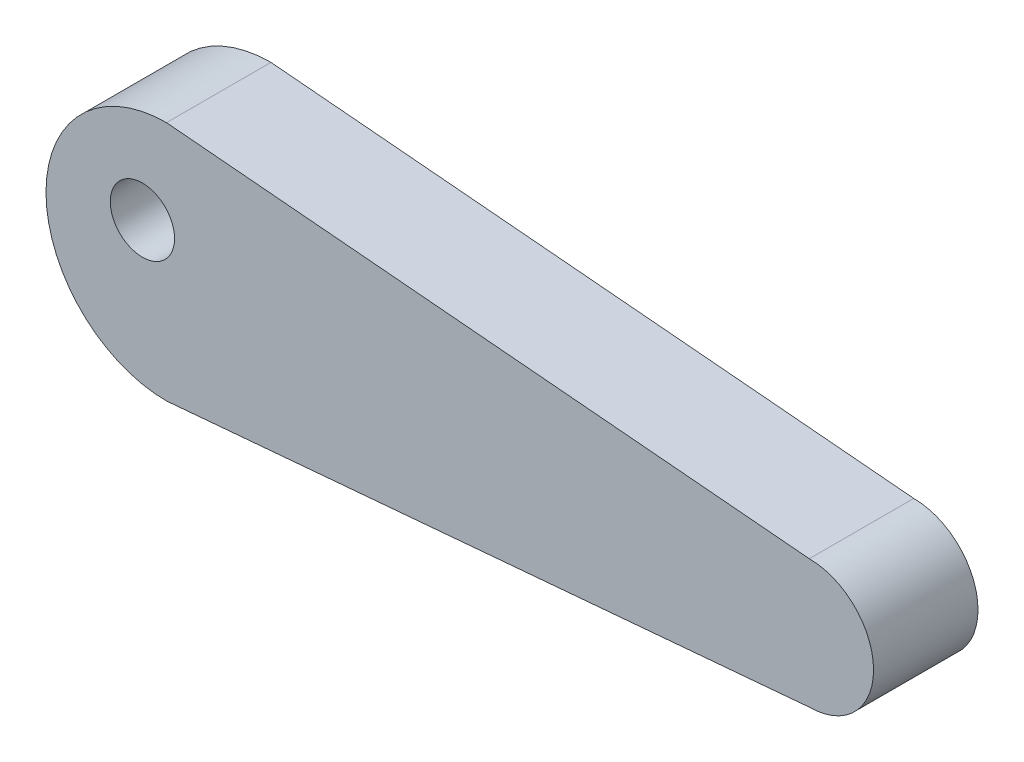
ISO-10303-21;
HEADER;
FILE_DESCRIPTION(('STEP AP214'),'2;1');
FILE_NAME('part.step','',(''),(''),'','','');
FILE_SCHEMA(('AUTOMOTIVE_DESIGN { 1 0 10303 214 1 1 1 1 }'));
ENDSEC;
DATA;
#1=APPLICATION_CONTEXT('core data for automotive mechanical design processes');
#2=APPLICATION_PROTOCOL_DEFINITION('international standard','automotive_design',2000,#1);
#3=PRODUCT_CONTEXT('',#1,'mechanical');
#4=PRODUCT('Part','Part','',(#3));
#5=PRODUCT_RELATED_PRODUCT_CATEGORY('part','',(#4));
#6=PRODUCT_DEFINITION_FORMATION('','',#4);
#7=PRODUCT_DEFINITION_CONTEXT('part definition',#1,'design');
#8=PRODUCT_DEFINITION('design','',#6,#7);
#9=PRODUCT_DEFINITION_SHAPE('','',#8);
#10=(LENGTH_UNIT() NAMED_UNIT(*) SI_UNIT(.MILLI.,.METRE.));
#11=(NAMED_UNIT(*) PLANE_ANGLE_UNIT() SI_UNIT($,.RADIAN.));
#12=(NAMED_UNIT(*) SI_UNIT($,.STERADIAN.) SOLID_ANGLE_UNIT());
#13=UNCERTAINTY_MEASURE_WITH_UNIT(LENGTH_MEASURE(1.E-05),#10,'distance_accuracy_value','');
#14=(GEOMETRIC_REPRESENTATION_CONTEXT(3) GLOBAL_UNCERTAINTY_ASSIGNED_CONTEXT((#13)) GLOBAL_UNIT_ASSIGNED_CONTEXT((#10,
#11,#12)) REPRESENTATION_CONTEXT('',''));
#15=CARTESIAN_POINT('',(0.,0.,0.));
#16=DIRECTION('',(0.,0.,1.));
#17=DIRECTION('',(1.,0.,0.));
#18=AXIS2_PLACEMENT_3D('',#15,#16,#17);
#19=CARTESIAN_POINT('',(0.,0.,13.));
#20=DIRECTION('',(0.,0.,-1.));
#21=DIRECTION('',(-1.,0.,0.));
#22=AXIS2_PLACEMENT_3D('',#19,#20,#21);
#23=CYLINDRICAL_SURFACE('',#22,15.);
#24=CARTESIAN_POINT('',(0.,0.,0.));
#25=DIRECTION('',(0.,0.,1.));
#26=DIRECTION('',(1.,0.,0.));
#27=AXIS2_PLACEMENT_3D('',#24,#25,#26);
#28=CIRCLE('',#27,15.);
#29=CARTESIAN_POINT('',(0.,15.,0.));
#30=VERTEX_POINT('',#29);
#31=CARTESIAN_POINT('',(0.,-15.,0.));
#32=VERTEX_POINT('',#31);
#33=EDGE_CURVE('E96',#30,#32,#28,.T.);
#34=ORIENTED_EDGE('',*,*,#33,.T.);
#35=DIRECTION('',(0.,0.,-1.));
#36=VECTOR('',#35,1.);
#37=CARTESIAN_POINT('',(0.,-15.,13.));
#38=LINE('',#37,#36);
#39=CARTESIAN_POINT('',(0.,-15.,13.));
#40=VERTEX_POINT('',#39);
#41=EDGE_CURVE('E11',#40,#32,#38,.T.);
#42=ORIENTED_EDGE('',*,*,#41,.F.);
#43=CARTESIAN_POINT('',(0.,0.,13.));
#44=DIRECTION('',(0.,0.,1.));
#45=DIRECTION('',(1.,0.,0.));
#46=AXIS2_PLACEMENT_3D('',#43,#44,#45);
#47=CIRCLE('',#46,15.);
#48=CARTESIAN_POINT('',(0.,15.,13.));
#49=VERTEX_POINT('',#48);
#50=EDGE_CURVE('E84',#49,#40,#47,.T.);
#51=ORIENTED_EDGE('',*,*,#50,.F.);
#52=DIRECTION('',(0.,0.,-1.));
#53=VECTOR('',#52,1.);
#54=CARTESIAN_POINT('',(0.,15.,13.));
#55=LINE('',#54,#53);
#56=EDGE_CURVE('E92',#49,#30,#55,.T.);
#57=ORIENTED_EDGE('',*,*,#56,.T.);
#58=EDGE_LOOP('',(#34,#42,#51,#57));
#59=FACE_BOUND('',#58,.T.);
#60=ADVANCED_FACE('F33',(#59),#23,.T.);
#61=CARTESIAN_POINT('',(0.,-15.,13.));
#62=DIRECTION('',(-0.08716695028091,0.996193717496113,0.));
#63=DIRECTION('',(-0.996193717496113,-0.08716695028091,0.));
#64=AXIS2_PLACEMENT_3D('',#61,#62,#63);
#65=PLANE('',#64);
#66=DIRECTION('',(0.996193717496113,0.08716695028091,0.));
#67=VECTOR('',#66,1.);
#68=CARTESIAN_POINT('',(0.,-15.,0.));
#69=LINE('',#68,#67);
#70=CARTESIAN_POINT('',(80.,-7.99999999999999,0.));
#71=VERTEX_POINT('',#70);
#72=EDGE_CURVE('E88',#32,#71,#69,.T.);
#73=ORIENTED_EDGE('',*,*,#72,.T.);
#74=DIRECTION('',(0.,0.,-1.));
#75=VECTOR('',#74,1.);
#76=CARTESIAN_POINT('',(80.,-7.99999999999999,13.));
#77=LINE('',#76,#75);
#78=CARTESIAN_POINT('',(80.,-7.99999999999999,13.));
#79=VERTEX_POINT('',#78);
#80=EDGE_CURVE('E41',#79,#71,#77,.T.);
#81=ORIENTED_EDGE('',*,*,#80,.F.);
#82=DIRECTION('',(0.996193717496113,0.08716695028091,0.));
#83=VECTOR('',#82,1.);
#84=CARTESIAN_POINT('',(0.,-15.,13.));
#85=LINE('',#84,#83);
#86=EDGE_CURVE('E79',#40,#79,#85,.T.);
#87=ORIENTED_EDGE('',*,*,#86,.F.);
#88=ORIENTED_EDGE('',*,*,#41,.T.);
#89=EDGE_LOOP('',(#73,#81,#87,#88));
#90=FACE_BOUND('',#89,.T.);
#91=ADVANCED_FACE('F87',(#90),#65,.F.);
#92=CARTESIAN_POINT('',(80.,0.,13.));
#93=DIRECTION('',(0.,0.,-1.));
#94=DIRECTION('',(-1.,0.,0.));
#95=AXIS2_PLACEMENT_3D('',#92,#93,#94);
#96=CYLINDRICAL_SURFACE('',#95,8.);
#97=CARTESIAN_POINT('',(80.,0.,0.));
#98=DIRECTION('',(0.,0.,1.));
#99=DIRECTION('',(1.,0.,0.));
#100=AXIS2_PLACEMENT_3D('',#97,#98,#99);
#101=CIRCLE('',#100,8.);
#102=CARTESIAN_POINT('',(80.,8.00000000000001,0.));
#103=VERTEX_POINT('',#102);
#104=EDGE_CURVE('E66',#71,#103,#101,.T.);
#105=ORIENTED_EDGE('',*,*,#104,.T.);
#106=DIRECTION('',(0.,0.,-1.));
#107=VECTOR('',#106,1.);
#108=CARTESIAN_POINT('',(80.,8.00000000000001,13.));
#109=LINE('',#108,#107);
#110=CARTESIAN_POINT('',(80.,8.00000000000001,13.));
#111=VERTEX_POINT('',#110);
#112=EDGE_CURVE('E89',#111,#103,#109,.T.);
#113=ORIENTED_EDGE('',*,*,#112,.F.);
#114=CARTESIAN_POINT('',(80.,0.,13.));
#115=DIRECTION('',(0.,0.,1.));
#116=DIRECTION('',(1.,0.,0.));
#117=AXIS2_PLACEMENT_3D('',#114,#115,#116);
#118=CIRCLE('',#117,8.);
#119=EDGE_CURVE('E82',#79,#111,#118,.T.);
#120=ORIENTED_EDGE('',*,*,#119,.F.);
#121=ORIENTED_EDGE('',*,*,#80,.T.);
#122=EDGE_LOOP('',(#105,#113,#120,#121));
#123=FACE_BOUND('',#122,.T.);
#124=ADVANCED_FACE('F90',(#123),#96,.T.);
#125=CARTESIAN_POINT('',(0.,15.,13.));
#126=DIRECTION('',(-0.0871669502809097,-0.996193717496113,0.));
#127=DIRECTION('',(0.996193717496113,-0.0871669502809097,0.));
#128=AXIS2_PLACEMENT_3D('',#125,#126,#127);
#129=PLANE('',#128);
#130=DIRECTION('',(-0.996193717496113,0.0871669502809097,0.));
#131=VECTOR('',#130,1.);
#132=CARTESIAN_POINT('',(0.,15.,0.));
#133=LINE('',#132,#131);
#134=EDGE_CURVE('E72',#103,#30,#133,.T.);
#135=ORIENTED_EDGE('',*,*,#134,.T.);
#136=ORIENTED_EDGE('',*,*,#56,.F.);
#137=DIRECTION('',(-0.996193717496113,0.0871669502809097,0.));
#138=VECTOR('',#137,1.);
#139=CARTESIAN_POINT('',(0.,15.,13.));
#140=LINE('',#139,#138);
#141=EDGE_CURVE('E49',#111,#49,#140,.T.);
#142=ORIENTED_EDGE('',*,*,#141,.F.);
#143=ORIENTED_EDGE('',*,*,#112,.T.);
#144=EDGE_LOOP('',(#135,#136,#142,#143));
#145=FACE_BOUND('',#144,.T.);
#146=ADVANCED_FACE('F104',(#145),#129,.F.);
#147=CARTESIAN_POINT('',(0.,0.,13.));
#148=DIRECTION('',(0.,0.,1.));
#149=DIRECTION('',(1.,0.,0.));
#150=AXIS2_PLACEMENT_3D('',#147,#148,#149);
#151=PLANE('',#150);
#152=CARTESIAN_POINT('',(-3.,3.,13.));
#153=DIRECTION('',(0.,0.,1.));
#154=DIRECTION('',(1.,0.,0.));
#155=AXIS2_PLACEMENT_3D('',#152,#153,#154);
#156=CIRCLE('',#155,4.);
#157=CARTESIAN_POINT('',(1.,3.,13.));
#158=VERTEX_POINT('',#157);
#159=EDGE_CURVE('E99',#158,#158,#156,.T.);
#160=ORIENTED_EDGE('',*,*,#159,.F.);
#161=EDGE_LOOP('',(#160));
#162=FACE_BOUND('',#161,.T.);
#163=ORIENTED_EDGE('',*,*,#50,.T.);
#164=ORIENTED_EDGE('',*,*,#86,.T.);
#165=ORIENTED_EDGE('',*,*,#119,.T.);
#166=ORIENTED_EDGE('',*,*,#141,.T.);
#167=EDGE_LOOP('',(#163,#164,#165,#166));
#168=FACE_BOUND('',#167,.T.);
#169=ADVANCED_FACE('F80',(#162,#168),#151,.T.);
#170=CARTESIAN_POINT('',(0.,0.,0.));
#171=DIRECTION('',(0.,0.,1.));
#172=DIRECTION('',(1.,0.,0.));
#173=AXIS2_PLACEMENT_3D('',#170,#171,#172);
#174=PLANE('',#173);
#175=CARTESIAN_POINT('',(-3.,3.,0.));
#176=DIRECTION('',(0.,0.,1.));
#177=DIRECTION('',(1.,0.,0.));
#178=AXIS2_PLACEMENT_3D('',#175,#176,#177);
#179=CIRCLE('',#178,4.);
#180=CARTESIAN_POINT('',(1.,3.,0.));
#181=VERTEX_POINT('',#180);
#182=EDGE_CURVE('E112',#181,#181,#179,.T.);
#183=ORIENTED_EDGE('',*,*,#182,.T.);
#184=EDGE_LOOP('',(#183));
#185=FACE_BOUND('',#184,.T.);
#186=ORIENTED_EDGE('',*,*,#33,.F.);
#187=ORIENTED_EDGE('',*,*,#134,.F.);
#188=ORIENTED_EDGE('',*,*,#104,.F.);
#189=ORIENTED_EDGE('',*,*,#72,.F.);
#190=EDGE_LOOP('',(#186,#187,#188,#189));
#191=FACE_BOUND('',#190,.T.);
#192=ADVANCED_FACE('F107',(#185,#191),#174,.F.);
#193=CARTESIAN_POINT('',(-3.,3.,0.));
#194=DIRECTION('',(0.,0.,1.));
#195=DIRECTION('',(1.,0.,0.));
#196=AXIS2_PLACEMENT_3D('',#193,#194,#195);
#197=CYLINDRICAL_SURFACE('',#196,4.);
#198=CARTESIAN_POINT('',(1.,3.,13.));
#199=CARTESIAN_POINT('',(1.,3.,12.8645833333333));
#200=CARTESIAN_POINT('',(1.,3.,12.7291666666667));
#201=CARTESIAN_POINT('',(1.,3.,12.4583333333333));
#202=CARTESIAN_POINT('',(1.,3.,12.3229166666667));
#203=CARTESIAN_POINT('',(1.,3.,12.0520833333333));
#204=CARTESIAN_POINT('',(1.,3.,11.9166666666667));
#205=CARTESIAN_POINT('',(1.,3.,11.6458333333333));
#206=CARTESIAN_POINT('',(1.,3.,11.5104166666667));
#207=CARTESIAN_POINT('',(1.,3.,11.2395833333333));
#208=CARTESIAN_POINT('',(1.,3.,11.1041666666667));
#209=CARTESIAN_POINT('',(1.,3.,10.8333333333333));
#210=CARTESIAN_POINT('',(1.,3.,10.6979166666667));
#211=CARTESIAN_POINT('',(1.,3.,10.4270833333333));
#212=CARTESIAN_POINT('',(1.,3.,10.2916666666667));
#213=CARTESIAN_POINT('',(1.,3.,10.0208333333333));
#214=CARTESIAN_POINT('',(1.,3.,9.88541666666667));
#215=CARTESIAN_POINT('',(1.,3.,9.61458333333333));
#216=CARTESIAN_POINT('',(1.,3.,9.47916666666667));
#217=CARTESIAN_POINT('',(1.,3.,9.20833333333333));
#218=CARTESIAN_POINT('',(1.,3.,9.07291666666667));
#219=CARTESIAN_POINT('',(1.,3.,8.80208333333333));
#220=CARTESIAN_POINT('',(1.,3.,8.66666666666667));
#221=CARTESIAN_POINT('',(1.,3.,8.39583333333333));
#222=CARTESIAN_POINT('',(1.,3.,8.26041666666667));
#223=CARTESIAN_POINT('',(1.,3.,7.98958333333333));
#224=CARTESIAN_POINT('',(1.,3.,7.85416666666667));
#225=CARTESIAN_POINT('',(1.,3.,7.58333333333333));
#226=CARTESIAN_POINT('',(1.,3.,7.44791666666667));
#227=CARTESIAN_POINT('',(1.,3.,7.17708333333333));
#228=CARTESIAN_POINT('',(1.,3.,7.04166666666667));
#229=CARTESIAN_POINT('',(1.,3.,6.77083333333333));
#230=CARTESIAN_POINT('',(1.,3.,6.63541666666667));
#231=CARTESIAN_POINT('',(1.,3.,6.36458333333333));
#232=CARTESIAN_POINT('',(1.,3.,6.22916666666667));
#233=CARTESIAN_POINT('',(1.,3.,5.95833333333333));
#234=CARTESIAN_POINT('',(1.,3.,5.82291666666667));
#235=CARTESIAN_POINT('',(1.,3.,5.55208333333333));
#236=CARTESIAN_POINT('',(1.,3.,5.41666666666667));
#237=CARTESIAN_POINT('',(1.,3.,5.14583333333333));
#238=CARTESIAN_POINT('',(1.,3.,5.01041666666667));
#239=CARTESIAN_POINT('',(1.,3.,4.73958333333333));
#240=CARTESIAN_POINT('',(1.,3.,4.60416666666667));
#241=CARTESIAN_POINT('',(1.,3.,4.33333333333333));
#242=CARTESIAN_POINT('',(1.,3.,4.19791666666667));
#243=CARTESIAN_POINT('',(1.,3.,3.92708333333333));
#244=CARTESIAN_POINT('',(1.,3.,3.79166666666667));
#245=CARTESIAN_POINT('',(1.,3.,3.52083333333333));
#246=CARTESIAN_POINT('',(1.,3.,3.38541666666667));
#247=CARTESIAN_POINT('',(1.,3.,3.11458333333333));
#248=CARTESIAN_POINT('',(1.,3.,2.97916666666667));
#249=CARTESIAN_POINT('',(1.,3.,2.70833333333333));
#250=CARTESIAN_POINT('',(1.,3.,2.57291666666667));
#251=CARTESIAN_POINT('',(1.,3.,2.30208333333333));
#252=CARTESIAN_POINT('',(1.,3.,2.16666666666667));
#253=CARTESIAN_POINT('',(1.,3.,1.89583333333333));
#254=CARTESIAN_POINT('',(1.,3.,1.76041666666667));
#255=CARTESIAN_POINT('',(1.,3.,1.48958333333333));
#256=CARTESIAN_POINT('',(1.,3.,1.35416666666667));
#257=CARTESIAN_POINT('',(1.,3.,1.08333333333333));
#258=CARTESIAN_POINT('',(1.,3.,0.947916666666667));
#259=CARTESIAN_POINT('',(1.,3.,0.677083333333334));
#260=CARTESIAN_POINT('',(1.,3.,0.541666666666667));
#261=CARTESIAN_POINT('',(1.,3.,0.270833333333334));
#262=CARTESIAN_POINT('',(1.,3.,0.135416666666667));
#263=CARTESIAN_POINT('',(1.,3.,0.));
#264=B_SPLINE_CURVE_WITH_KNOTS('',3,(#198,#199,#200,#201,#202,#203,#204,#205,#206,#207,#208,
#209,#210,#211,#212,#213,#214,#215,#216,#217,#218,#219,#220,#221,#222,#223,#224,#225,#226,#227,
#228,#229,#230,#231,#232,#233,#234,#235,#236,#237,#238,#239,#240,#241,#242,#243,#244,#245,#246,
#247,#248,#249,#250,#251,#252,#253,#254,#255,#256,#257,#258,#259,#260,#261,#262,#263),
.UNSPECIFIED.,.F.,.F.,(4,2,2,2,2,2,2,2,2,2,2,2,2,2,2,2,2,2,2,2,2,2,2,2,2,2,2,2,2,2,2,2,4),(0.,
0.40625,0.812500000000001,1.21875,1.625,2.03125,2.4375,2.84375,3.25,3.65625,4.0625,4.46875,
4.875,5.28125,5.6875,6.09375,6.5,6.90625,7.3125,7.71875,8.125,8.53125,8.9375,9.34375,9.75,
10.15625,10.5625,10.96875,11.375,11.78125,12.1875,12.59375,13.),.UNSPECIFIED.);
#265=EDGE_CURVE('BSEAM117',#158,#181,#264,.T.);
#266=ORIENTED_EDGE('',*,*,#159,.T.);
#267=ORIENTED_EDGE('',*,*,#182,.F.);
#268=ORIENTED_EDGE('',*,*,#265,.T.);
#269=ORIENTED_EDGE('',*,*,#265,.F.);
#270=EDGE_LOOP('',(#266,#268,#267,#269));
#271=FACE_BOUND('',#270,.T.);
#272=ADVANCED_FACE('F117',(#271),#197,.F.);
#273=CLOSED_SHELL('',(#60,#91,#124,#146,#169,#192,#272));
#274=MANIFOLD_SOLID_BREP('B2',#273);
#275=ADVANCED_BREP_SHAPE_REPRESENTATION('',(#18,#274),#14);
#276=SHAPE_DEFINITION_REPRESENTATION(#9,#275);
ENDSEC;
END-ISO-10303-21;
